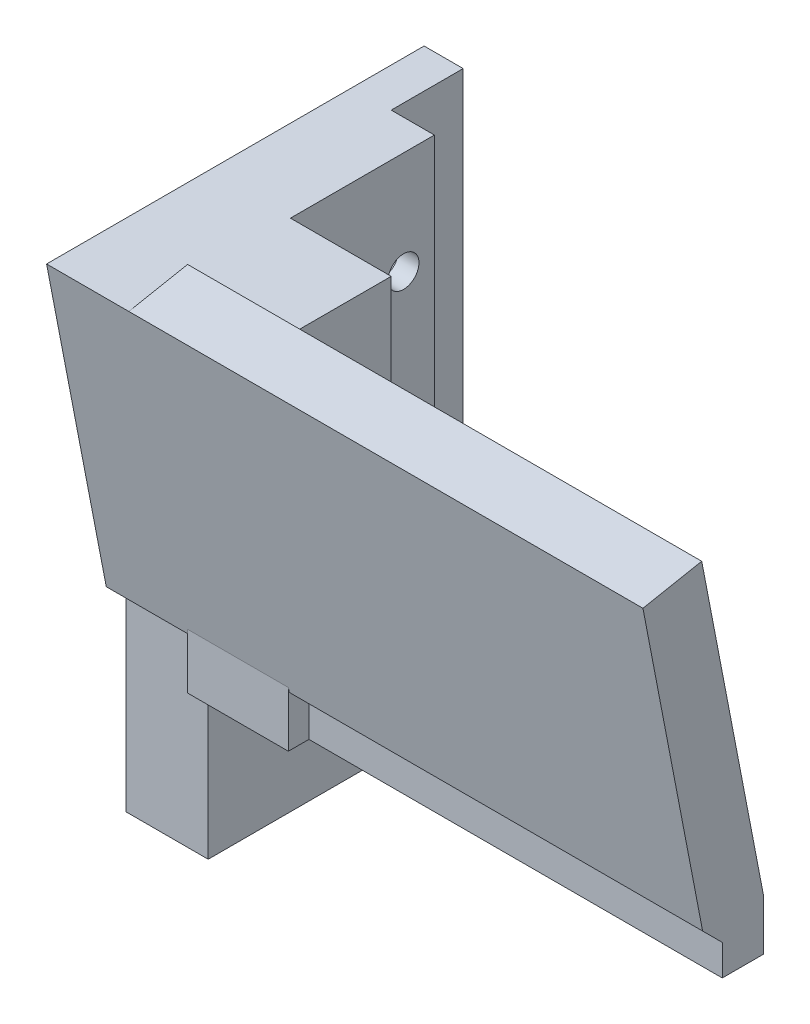
ISO-10303-21;
HEADER;
FILE_DESCRIPTION(('STEP AP214'),'2;1');
FILE_NAME('part.step','',(''),(''),'','','');
FILE_SCHEMA(('AUTOMOTIVE_DESIGN { 1 0 10303 214 1 1 1 1 }'));
ENDSEC;
DATA;
#1=APPLICATION_CONTEXT('core data for automotive mechanical design processes');
#2=APPLICATION_PROTOCOL_DEFINITION('international standard','automotive_design',2000,#1);
#3=PRODUCT_CONTEXT('',#1,'mechanical');
#4=PRODUCT('Part','Part','',(#3));
#5=PRODUCT_RELATED_PRODUCT_CATEGORY('part','',(#4));
#6=PRODUCT_DEFINITION_FORMATION('','',#4);
#7=PRODUCT_DEFINITION_CONTEXT('part definition',#1,'design');
#8=PRODUCT_DEFINITION('design','',#6,#7);
#9=PRODUCT_DEFINITION_SHAPE('','',#8);
#10=(LENGTH_UNIT() NAMED_UNIT(*) SI_UNIT(.MILLI.,.METRE.));
#11=(NAMED_UNIT(*) PLANE_ANGLE_UNIT() SI_UNIT($,.RADIAN.));
#12=(NAMED_UNIT(*) SI_UNIT($,.STERADIAN.) SOLID_ANGLE_UNIT());
#13=UNCERTAINTY_MEASURE_WITH_UNIT(LENGTH_MEASURE(1.E-05),#10,'distance_accuracy_value','');
#14=(GEOMETRIC_REPRESENTATION_CONTEXT(3) GLOBAL_UNCERTAINTY_ASSIGNED_CONTEXT((#13)) GLOBAL_UNIT_ASSIGNED_CONTEXT((#10,
#11,#12)) REPRESENTATION_CONTEXT('',''));
#15=CARTESIAN_POINT('',(0.,0.,0.));
#16=DIRECTION('',(0.,0.,1.));
#17=DIRECTION('',(1.,0.,0.));
#18=AXIS2_PLACEMENT_3D('',#15,#16,#17);
#19=CARTESIAN_POINT('',(0.,-17.211102550928,10.));
#20=DIRECTION('',(0.,0.,-1.));
#21=DIRECTION('',(-1.,0.,0.));
#22=AXIS2_PLACEMENT_3D('',#19,#20,#21);
#23=PLANE('',#22);
#24=DIRECTION('',(0.,-1.,0.));
#25=VECTOR('',#24,1.);
#26=CARTESIAN_POINT('',(0.,-5.,10.));
#27=LINE('',#26,#25);
#28=CARTESIAN_POINT('',(0.,5.,10.));
#29=VERTEX_POINT('',#28);
#30=CARTESIAN_POINT('',(0.,-10.,10.));
#31=VERTEX_POINT('',#30);
#32=EDGE_CURVE('E233',#29,#31,#27,.T.);
#33=ORIENTED_EDGE('',*,*,#32,.F.);
#34=DIRECTION('',(0.,1.,0.));
#35=VECTOR('',#34,1.);
#36=CARTESIAN_POINT('',(0.,-17.211102550928,10.));
#37=LINE('',#36,#35);
#38=CARTESIAN_POINT('',(0.,7.99999999999999,10.));
#39=VERTEX_POINT('',#38);
#40=EDGE_CURVE('E214',#29,#39,#37,.T.);
#41=ORIENTED_EDGE('',*,*,#40,.T.);
#42=DIRECTION('',(-1.,0.,0.));
#43=VECTOR('',#42,1.);
#44=CARTESIAN_POINT('',(-5.,7.99999999999999,10.));
#45=LINE('',#44,#43);
#46=CARTESIAN_POINT('',(-8.,7.99999999999999,10.));
#47=VERTEX_POINT('',#46);
#48=EDGE_CURVE('E349',#39,#47,#45,.T.);
#49=ORIENTED_EDGE('',*,*,#48,.T.);
#50=DIRECTION('',(0.,1.,0.));
#51=VECTOR('',#50,1.);
#52=CARTESIAN_POINT('',(-7.99999999999999,-10.,10.));
#53=LINE('',#52,#51);
#54=CARTESIAN_POINT('',(-7.99999999999999,-10.,10.));
#55=VERTEX_POINT('',#54);
#56=EDGE_CURVE('E271',#55,#47,#53,.T.);
#57=ORIENTED_EDGE('',*,*,#56,.F.);
#58=DIRECTION('',(-1.,0.,0.));
#59=VECTOR('',#58,1.);
#60=CARTESIAN_POINT('',(0.,-10.,10.));
#61=LINE('',#60,#59);
#62=EDGE_CURVE('E309',#31,#55,#61,.T.);
#63=ORIENTED_EDGE('',*,*,#62,.F.);
#64=EDGE_LOOP('',(#33,#41,#49,#57,#63));
#65=FACE_BOUND('',#64,.T.);
#66=ADVANCED_FACE('F42',(#65),#23,.F.);
#67=CARTESIAN_POINT('',(-20.,5.,-56.8276253029822));
#68=DIRECTION('',(0.,1.,0.));
#69=DIRECTION('',(-1.,0.,0.));
#70=AXIS2_PLACEMENT_3D('',#67,#68,#69);
#71=PLANE('',#70);
#72=DIRECTION('',(-1.,0.,0.));
#73=VECTOR('',#72,1.);
#74=CARTESIAN_POINT('',(-20.,5.,10.));
#75=LINE('',#74,#73);
#76=CARTESIAN_POINT('',(50.,5.,10.));
#77=VERTEX_POINT('',#76);
#78=CARTESIAN_POINT('',(9.8,5.,10.));
#79=VERTEX_POINT('',#78);
#80=EDGE_CURVE('E297',#77,#79,#75,.T.);
#81=ORIENTED_EDGE('',*,*,#80,.T.);
#82=DIRECTION('',(0.,0.,1.));
#83=VECTOR('',#82,1.);
#84=CARTESIAN_POINT('',(9.8,5.,2.));
#85=LINE('',#84,#83);
#86=CARTESIAN_POINT('',(9.8,5.,12.));
#87=VERTEX_POINT('',#86);
#88=EDGE_CURVE('E208',#79,#87,#85,.T.);
#89=ORIENTED_EDGE('',*,*,#88,.T.);
#90=DIRECTION('',(-1.,0.,0.));
#91=VECTOR('',#90,1.);
#92=CARTESIAN_POINT('',(0.,5.,12.));
#93=LINE('',#92,#91);
#94=CARTESIAN_POINT('',(0.,5.,12.));
#95=VERTEX_POINT('',#94);
#96=EDGE_CURVE('E212',#87,#95,#93,.T.);
#97=ORIENTED_EDGE('',*,*,#96,.T.);
#98=DIRECTION('',(0.,0.,-1.));
#99=VECTOR('',#98,1.);
#100=CARTESIAN_POINT('',(0.,5.,2.));
#101=LINE('',#100,#99);
#102=EDGE_CURVE('E215',#95,#29,#101,.T.);
#103=ORIENTED_EDGE('',*,*,#102,.T.);
#104=DIRECTION('',(0.,0.,-1.));
#105=VECTOR('',#104,1.);
#106=CARTESIAN_POINT('',(0.,5.,22.8062484748657));
#107=LINE('',#106,#105);
#108=CARTESIAN_POINT('',(0.,5.,2.));
#109=VERTEX_POINT('',#108);
#110=EDGE_CURVE('E232',#29,#109,#107,.T.);
#111=ORIENTED_EDGE('',*,*,#110,.T.);
#112=DIRECTION('',(1.,0.,0.));
#113=VECTOR('',#112,1.);
#114=CARTESIAN_POINT('',(0.,5.,2.));
#115=LINE('',#114,#113);
#116=CARTESIAN_POINT('',(9.8,5.,2.));
#117=VERTEX_POINT('',#116);
#118=EDGE_CURVE('E376',#109,#117,#115,.T.);
#119=ORIENTED_EDGE('',*,*,#118,.T.);
#120=CARTESIAN_POINT('',(9.8,5.,6.));
#121=VERTEX_POINT('',#120);
#122=EDGE_CURVE('E194',#117,#121,#85,.T.);
#123=ORIENTED_EDGE('',*,*,#122,.T.);
#124=DIRECTION('',(-1.,0.,0.));
#125=VECTOR('',#124,1.);
#126=CARTESIAN_POINT('',(0.,5.,6.));
#127=LINE('',#126,#125);
#128=CARTESIAN_POINT('',(50.,5.,6.));
#129=VERTEX_POINT('',#128);
#130=EDGE_CURVE('E346',#129,#121,#127,.T.);
#131=ORIENTED_EDGE('',*,*,#130,.F.);
#132=DIRECTION('',(0.,0.,1.));
#133=VECTOR('',#132,1.);
#134=CARTESIAN_POINT('',(50.,5.,10.));
#135=LINE('',#134,#133);
#136=EDGE_CURVE('E235',#129,#77,#135,.T.);
#137=ORIENTED_EDGE('',*,*,#136,.T.);
#138=EDGE_LOOP('',(#81,#89,#97,#103,#111,#119,#123,#131,#137));
#139=FACE_BOUND('',#138,.T.);
#140=ADVANCED_FACE('F379',(#139),#71,.F.);
#141=CARTESIAN_POINT('',(50.,0.,0.));
#142=DIRECTION('',(-1.,0.,0.));
#143=DIRECTION('',(0.,0.,1.));
#144=AXIS2_PLACEMENT_3D('',#141,#142,#143);
#145=PLANE('',#144);
#146=DIRECTION('',(0.,1.,0.));
#147=VECTOR('',#146,1.);
#148=CARTESIAN_POINT('',(50.,-60.1597448159378,10.));
#149=LINE('',#148,#147);
#150=CARTESIAN_POINT('',(50.,7.99999999999999,10.));
#151=VERTEX_POINT('',#150);
#152=EDGE_CURVE('E300',#77,#151,#149,.T.);
#153=ORIENTED_EDGE('',*,*,#152,.F.);
#154=ORIENTED_EDGE('',*,*,#136,.F.);
#155=DIRECTION('',(0.,1.,0.));
#156=VECTOR('',#155,1.);
#157=CARTESIAN_POINT('',(50.,-60.3587132480567,6.));
#158=LINE('',#157,#156);
#159=CARTESIAN_POINT('',(50.,10.,6.));
#160=VERTEX_POINT('',#159);
#161=EDGE_CURVE('E304',#129,#160,#158,.T.);
#162=ORIENTED_EDGE('',*,*,#161,.T.);
#163=DIRECTION('',(0.,0.981896777402909,0.189416785227133));
#164=VECTOR('',#163,1.);
#165=CARTESIAN_POINT('',(50.,41.10273810926,12.));
#166=LINE('',#165,#164);
#167=CARTESIAN_POINT('',(50.,41.10273810926,12.));
#168=VERTEX_POINT('',#167);
#169=EDGE_CURVE('E315',#160,#168,#166,.T.);
#170=ORIENTED_EDGE('',*,*,#169,.T.);
#171=DIRECTION('',(0.,-0.189416785227132,0.981896777402909));
#172=VECTOR('',#171,1.);
#173=CARTESIAN_POINT('',(50.,40.,17.7163624359023));
#174=LINE('',#173,#172);
#175=CARTESIAN_POINT('',(50.,40.,17.7163624359023));
#176=VERTEX_POINT('',#175);
#177=EDGE_CURVE('E317',#168,#176,#174,.T.);
#178=ORIENTED_EDGE('',*,*,#177,.T.);
#179=DIRECTION('',(0.,-0.981896777402909,-0.189416785227133));
#180=VECTOR('',#179,1.);
#181=CARTESIAN_POINT('',(50.,0.,10.));
#182=LINE('',#181,#180);
#183=CARTESIAN_POINT('',(50.,9.91214200582735,11.9121420058274));
#184=VERTEX_POINT('',#183);
#185=EDGE_CURVE('E320',#176,#184,#182,.T.);
#186=ORIENTED_EDGE('',*,*,#185,.T.);
#187=DIRECTION('',(0.,0.707106781186544,0.707106781186551));
#188=VECTOR('',#187,1.);
#189=CARTESIAN_POINT('',(50.,-0.999999999999964,0.999999999999954));
#190=LINE('',#189,#188);
#191=EDGE_CURVE('E340',#184,#151,#190,.F.);
#192=ORIENTED_EDGE('',*,*,#191,.T.);
#193=EDGE_LOOP('',(#153,#154,#162,#170,#178,#186,#192));
#194=FACE_BOUND('',#193,.T.);
#195=ADVANCED_FACE('F391',(#194),#145,.F.);
#196=CARTESIAN_POINT('',(0.,-60.3587132480567,6.));
#197=DIRECTION('',(0.,0.,1.));
#198=DIRECTION('',(1.,0.,0.));
#199=AXIS2_PLACEMENT_3D('',#196,#197,#198);
#200=PLANE('',#199);
#201=ORIENTED_EDGE('',*,*,#130,.T.);
#202=DIRECTION('',(0.,1.,0.));
#203=VECTOR('',#202,1.);
#204=CARTESIAN_POINT('',(9.8,-60.3587132480567,6.));
#205=LINE('',#204,#203);
#206=CARTESIAN_POINT('',(9.8,10.,6.));
#207=VERTEX_POINT('',#206);
#208=EDGE_CURVE('E229',#121,#207,#205,.T.);
#209=ORIENTED_EDGE('',*,*,#208,.T.);
#210=DIRECTION('',(-1.,0.,0.));
#211=VECTOR('',#210,1.);
#212=CARTESIAN_POINT('',(50.,10.,6.));
#213=LINE('',#212,#211);
#214=EDGE_CURVE('E332',#160,#207,#213,.T.);
#215=ORIENTED_EDGE('',*,*,#214,.F.);
#216=ORIENTED_EDGE('',*,*,#161,.F.);
#217=EDGE_LOOP('',(#201,#209,#215,#216));
#218=FACE_BOUND('',#217,.T.);
#219=ADVANCED_FACE('F461',(#218),#200,.F.);
#220=CARTESIAN_POINT('',(4.24264068711929,0.,-8.99999999999999));
#221=DIRECTION('',(-1.,0.,0.));
#222=DIRECTION('',(0.,-1.,0.));
#223=AXIS2_PLACEMENT_3D('',#220,#221,#222);
#224=CYLINDRICAL_SURFACE('',#223,1.5);
#225=CARTESIAN_POINT('',(0.,0.,-8.99999999999999));
#226=DIRECTION('',(-1.,0.,0.));
#227=DIRECTION('',(0.,0.,1.));
#228=AXIS2_PLACEMENT_3D('',#225,#226,#227);
#229=CIRCLE('',#228,1.5);
#230=CARTESIAN_POINT('',(0.,0.,-7.49999999999999));
#231=VERTEX_POINT('',#230);
#232=EDGE_CURVE('E256',#231,#231,#229,.F.);
#233=ORIENTED_EDGE('',*,*,#232,.T.);
#234=EDGE_LOOP('',(#233));
#235=FACE_BOUND('',#234,.T.);
#236=CARTESIAN_POINT('',(-2.,0.,-8.99999999999999));
#237=DIRECTION('',(-1.,0.,0.));
#238=DIRECTION('',(0.,0.,1.));
#239=AXIS2_PLACEMENT_3D('',#236,#237,#238);
#240=CIRCLE('',#239,1.5);
#241=CARTESIAN_POINT('',(-2.,0.,-7.49999999999999));
#242=VERTEX_POINT('',#241);
#243=EDGE_CURVE('E259',#242,#242,#240,.F.);
#244=ORIENTED_EDGE('',*,*,#243,.F.);
#245=EDGE_LOOP('',(#244));
#246=FACE_BOUND('',#245,.T.);
#247=ADVANCED_FACE('F465',(#235,#246),#224,.F.);
#248=CARTESIAN_POINT('',(4.24264068711929,30.,-9.));
#249=DIRECTION('',(-1.,0.,0.));
#250=DIRECTION('',(0.,-1.,0.));
#251=AXIS2_PLACEMENT_3D('',#248,#249,#250);
#252=CYLINDRICAL_SURFACE('',#251,1.5);
#253=CARTESIAN_POINT('',(0.,30.,-9.));
#254=DIRECTION('',(-1.,0.,0.));
#255=DIRECTION('',(0.,0.,1.));
#256=AXIS2_PLACEMENT_3D('',#253,#254,#255);
#257=CIRCLE('',#256,1.5);
#258=CARTESIAN_POINT('',(0.,30.,-7.5));
#259=VERTEX_POINT('',#258);
#260=EDGE_CURVE('E252',#259,#259,#257,.F.);
#261=ORIENTED_EDGE('',*,*,#260,.T.);
#262=EDGE_LOOP('',(#261));
#263=FACE_BOUND('',#262,.T.);
#264=CARTESIAN_POINT('',(-2.,30.,-9.));
#265=DIRECTION('',(-1.,0.,0.));
#266=DIRECTION('',(0.,0.,1.));
#267=AXIS2_PLACEMENT_3D('',#264,#265,#266);
#268=CIRCLE('',#267,1.5);
#269=CARTESIAN_POINT('',(-2.,30.,-7.5));
#270=VERTEX_POINT('',#269);
#271=EDGE_CURVE('E247',#270,#270,#268,.F.);
#272=ORIENTED_EDGE('',*,*,#271,.F.);
#273=EDGE_LOOP('',(#272));
#274=FACE_BOUND('',#273,.T.);
#275=ADVANCED_FACE('F470',(#263,#274),#252,.F.);
#276=CARTESIAN_POINT('',(0.,40.,0.));
#277=DIRECTION('',(-1.,0.,0.));
#278=DIRECTION('',(0.,0.,1.));
#279=AXIS2_PLACEMENT_3D('',#276,#277,#278);
#280=PLANE('',#279);
#281=ORIENTED_EDGE('',*,*,#260,.F.);
#282=EDGE_LOOP('',(#281));
#283=FACE_BOUND('',#282,.T.);
#284=ORIENTED_EDGE('',*,*,#232,.F.);
#285=EDGE_LOOP('',(#284));
#286=FACE_BOUND('',#285,.T.);
#287=DIRECTION('',(0.,0.,-1.));
#288=VECTOR('',#287,1.);
#289=CARTESIAN_POINT('',(0.,40.,0.));
#290=LINE('',#289,#288);
#291=CARTESIAN_POINT('',(0.,40.,2.));
#292=VERTEX_POINT('',#291);
#293=CARTESIAN_POINT('',(0.,40.,-12.));
#294=VERTEX_POINT('',#293);
#295=EDGE_CURVE('E312',#292,#294,#290,.T.);
#296=ORIENTED_EDGE('',*,*,#295,.F.);
#297=DIRECTION('',(0.,1.,0.));
#298=VECTOR('',#297,1.);
#299=CARTESIAN_POINT('',(0.,-9.00142849854971,2.));
#300=LINE('',#299,#298);
#301=EDGE_CURVE('E197',#109,#292,#300,.T.);
#302=ORIENTED_EDGE('',*,*,#301,.F.);
#303=ORIENTED_EDGE('',*,*,#110,.F.);
#304=ORIENTED_EDGE('',*,*,#32,.T.);
#305=DIRECTION('',(0.,0.,1.));
#306=VECTOR('',#305,1.);
#307=CARTESIAN_POINT('',(0.,-10.,0.));
#308=LINE('',#307,#306);
#309=CARTESIAN_POINT('',(0.,-10.,-12.));
#310=VERTEX_POINT('',#309);
#311=EDGE_CURVE('E306',#310,#31,#308,.T.);
#312=ORIENTED_EDGE('',*,*,#311,.F.);
#313=DIRECTION('',(0.,-1.,0.));
#314=VECTOR('',#313,1.);
#315=CARTESIAN_POINT('',(0.,40.,-12.));
#316=LINE('',#315,#314);
#317=EDGE_CURVE('E276',#294,#310,#316,.T.);
#318=ORIENTED_EDGE('',*,*,#317,.F.);
#319=EDGE_LOOP('',(#296,#302,#303,#304,#312,#318));
#320=FACE_BOUND('',#319,.T.);
#321=ADVANCED_FACE('F411',(#283,#286,#320),#280,.F.);
#322=CARTESIAN_POINT('',(0.,0.,0.));
#323=DIRECTION('',(-1.,0.,0.));
#324=DIRECTION('',(0.,0.,1.));
#325=AXIS2_PLACEMENT_3D('',#322,#323,#324);
#326=PLANE('',#325);
#327=DIRECTION('',(0.,0.981896777402909,0.189416785227133));
#328=VECTOR('',#327,1.);
#329=CARTESIAN_POINT('',(0.,41.10273810926,12.));
#330=LINE('',#329,#328);
#331=CARTESIAN_POINT('',(0.,40.,11.7872718269267));
#332=VERTEX_POINT('',#331);
#333=CARTESIAN_POINT('',(0.,41.10273810926,12.));
#334=VERTEX_POINT('',#333);
#335=EDGE_CURVE('E314',#332,#334,#330,.T.);
#336=ORIENTED_EDGE('',*,*,#335,.F.);
#337=DIRECTION('',(0.,0.,-1.));
#338=VECTOR('',#337,1.);
#339=CARTESIAN_POINT('',(0.,40.,45.516908777501));
#340=LINE('',#339,#338);
#341=CARTESIAN_POINT('',(0.,40.,17.7163624359023));
#342=VERTEX_POINT('',#341);
#343=EDGE_CURVE('E66',#342,#332,#340,.T.);
#344=ORIENTED_EDGE('',*,*,#343,.F.);
#345=DIRECTION('',(0.,-0.189416785227132,0.981896777402909));
#346=VECTOR('',#345,1.);
#347=CARTESIAN_POINT('',(0.,40.,17.7163624359023));
#348=LINE('',#347,#346);
#349=EDGE_CURVE('E318',#334,#342,#348,.T.);
#350=ORIENTED_EDGE('',*,*,#349,.F.);
#351=EDGE_LOOP('',(#336,#344,#350));
#352=FACE_BOUND('',#351,.T.);
#353=ADVANCED_FACE('F423',(#352),#326,.T.);
#354=CARTESIAN_POINT('',(0.,-10.,0.));
#355=DIRECTION('',(0.,-1.,0.));
#356=DIRECTION('',(0.,0.,-1.));
#357=AXIS2_PLACEMENT_3D('',#354,#355,#356);
#358=PLANE('',#357);
#359=ORIENTED_EDGE('',*,*,#311,.T.);
#360=ORIENTED_EDGE('',*,*,#62,.T.);
#361=DIRECTION('',(0.,0.,1.));
#362=VECTOR('',#361,1.);
#363=CARTESIAN_POINT('',(-7.99999999999999,-10.,-19.));
#364=LINE('',#363,#362);
#365=CARTESIAN_POINT('',(-7.99999999999999,-10.,-19.));
#366=VERTEX_POINT('',#365);
#367=EDGE_CURVE('E268',#366,#55,#364,.T.);
#368=ORIENTED_EDGE('',*,*,#367,.F.);
#369=DIRECTION('',(-1.,0.,0.));
#370=VECTOR('',#369,1.);
#371=CARTESIAN_POINT('',(0.,-10.,-19.));
#372=LINE('',#371,#370);
#373=CARTESIAN_POINT('',(-4.2,-10.,-19.));
#374=VERTEX_POINT('',#373);
#375=EDGE_CURVE('E290',#374,#366,#372,.T.);
#376=ORIENTED_EDGE('',*,*,#375,.F.);
#377=DIRECTION('',(0.,0.,-1.));
#378=VECTOR('',#377,1.);
#379=CARTESIAN_POINT('',(-4.2,-10.,-19.));
#380=LINE('',#379,#378);
#381=CARTESIAN_POINT('',(-4.2,-10.,-12.));
#382=VERTEX_POINT('',#381);
#383=EDGE_CURVE('E58',#382,#374,#380,.T.);
#384=ORIENTED_EDGE('',*,*,#383,.F.);
#385=DIRECTION('',(1.,0.,0.));
#386=VECTOR('',#385,1.);
#387=CARTESIAN_POINT('',(-4.2,-10.,-12.));
#388=LINE('',#387,#386);
#389=EDGE_CURVE('E287',#382,#310,#388,.T.);
#390=ORIENTED_EDGE('',*,*,#389,.T.);
#391=EDGE_LOOP('',(#359,#360,#368,#376,#384,#390));
#392=FACE_BOUND('',#391,.T.);
#393=ADVANCED_FACE('F421',(#392),#358,.T.);
#394=CARTESIAN_POINT('',(0.,40.,0.));
#395=DIRECTION('',(0.,1.,0.));
#396=DIRECTION('',(0.,0.,1.));
#397=AXIS2_PLACEMENT_3D('',#394,#395,#396);
#398=PLANE('',#397);
#399=DIRECTION('',(1.,0.,0.));
#400=VECTOR('',#399,1.);
#401=CARTESIAN_POINT('',(-4.2,40.,-12.));
#402=LINE('',#401,#400);
#403=CARTESIAN_POINT('',(-4.2,40.,-12.));
#404=VERTEX_POINT('',#403);
#405=EDGE_CURVE('E285',#404,#294,#402,.T.);
#406=ORIENTED_EDGE('',*,*,#405,.F.);
#407=DIRECTION('',(0.,0.,1.));
#408=VECTOR('',#407,1.);
#409=CARTESIAN_POINT('',(-4.2,40.,-19.));
#410=LINE('',#409,#408);
#411=CARTESIAN_POINT('',(-4.2,40.,-19.));
#412=VERTEX_POINT('',#411);
#413=EDGE_CURVE('E279',#412,#404,#410,.T.);
#414=ORIENTED_EDGE('',*,*,#413,.F.);
#415=DIRECTION('',(1.,0.,0.));
#416=VECTOR('',#415,1.);
#417=CARTESIAN_POINT('',(-5.,40.,-19.));
#418=LINE('',#417,#416);
#419=CARTESIAN_POINT('',(-8.,40.,-19.));
#420=VERTEX_POINT('',#419);
#421=EDGE_CURVE('E294',#420,#412,#418,.T.);
#422=ORIENTED_EDGE('',*,*,#421,.F.);
#423=DIRECTION('',(0.,0.,-1.));
#424=VECTOR('',#423,1.);
#425=CARTESIAN_POINT('',(-8.,40.,17.7163624359023));
#426=LINE('',#425,#424);
#427=CARTESIAN_POINT('',(-8.,40.,17.7163624359023));
#428=VERTEX_POINT('',#427);
#429=EDGE_CURVE('E262',#428,#420,#426,.T.);
#430=ORIENTED_EDGE('',*,*,#429,.F.);
#431=DIRECTION('',(1.,0.,0.));
#432=VECTOR('',#431,1.);
#433=CARTESIAN_POINT('',(0.,40.,17.7163624359023));
#434=LINE('',#433,#432);
#435=EDGE_CURVE('E302',#428,#342,#434,.T.);
#436=ORIENTED_EDGE('',*,*,#435,.T.);
#437=ORIENTED_EDGE('',*,*,#343,.T.);
#438=DIRECTION('',(-1.,0.,0.));
#439=VECTOR('',#438,1.);
#440=CARTESIAN_POINT('',(50.,40.,11.7872718269267));
#441=LINE('',#440,#439);
#442=CARTESIAN_POINT('',(9.8,40.,11.7872718269267));
#443=VERTEX_POINT('',#442);
#444=EDGE_CURVE('E12',#443,#332,#441,.T.);
#445=ORIENTED_EDGE('',*,*,#444,.F.);
#446=DIRECTION('',(0.,0.,-1.));
#447=VECTOR('',#446,1.);
#448=CARTESIAN_POINT('',(9.8,40.,2.));
#449=LINE('',#448,#447);
#450=CARTESIAN_POINT('',(9.8,40.,2.));
#451=VERTEX_POINT('',#450);
#452=EDGE_CURVE('E179',#443,#451,#449,.T.);
#453=ORIENTED_EDGE('',*,*,#452,.T.);
#454=DIRECTION('',(-1.,0.,0.));
#455=VECTOR('',#454,1.);
#456=CARTESIAN_POINT('',(0.,40.,2.));
#457=LINE('',#456,#455);
#458=EDGE_CURVE('E184',#451,#292,#457,.T.);
#459=ORIENTED_EDGE('',*,*,#458,.T.);
#460=ORIENTED_EDGE('',*,*,#295,.T.);
#461=EDGE_LOOP('',(#406,#414,#422,#430,#436,#437,#445,#453,#459,#460));
#462=FACE_BOUND('',#461,.T.);
#463=ADVANCED_FACE('F182',(#462),#398,.T.);
#464=CARTESIAN_POINT('',(50.,41.10273810926,12.));
#465=DIRECTION('',(0.,-0.189416785227133,0.981896777402909));
#466=DIRECTION('',(0.,-0.981896777402909,-0.189416785227133));
#467=AXIS2_PLACEMENT_3D('',#464,#465,#466);
#468=PLANE('',#467);
#469=ORIENTED_EDGE('',*,*,#214,.T.);
#470=DIRECTION('',(0.,0.981896777402909,0.189416785227133));
#471=VECTOR('',#470,1.);
#472=CARTESIAN_POINT('',(9.8,41.10273810926,12.));
#473=LINE('',#472,#471);
#474=EDGE_CURVE('E227',#207,#443,#473,.T.);
#475=ORIENTED_EDGE('',*,*,#474,.T.);
#476=ORIENTED_EDGE('',*,*,#444,.T.);
#477=ORIENTED_EDGE('',*,*,#335,.T.);
#478=DIRECTION('',(-1.,0.,0.));
#479=VECTOR('',#478,1.);
#480=CARTESIAN_POINT('',(50.,41.10273810926,12.));
#481=LINE('',#480,#479);
#482=EDGE_CURVE('E329',#168,#334,#481,.T.);
#483=ORIENTED_EDGE('',*,*,#482,.F.);
#484=ORIENTED_EDGE('',*,*,#169,.F.);
#485=EDGE_LOOP('',(#469,#475,#476,#477,#483,#484));
#486=FACE_BOUND('',#485,.T.);
#487=ADVANCED_FACE('F429',(#486),#468,.F.);
#488=CARTESIAN_POINT('',(50.,40.,17.7163624359023));
#489=DIRECTION('',(0.,-0.981896777402909,-0.189416785227132));
#490=DIRECTION('',(0.,0.189416785227132,-0.981896777402909));
#491=AXIS2_PLACEMENT_3D('',#488,#489,#490);
#492=PLANE('',#491);
#493=ORIENTED_EDGE('',*,*,#349,.T.);
#494=DIRECTION('',(-1.,0.,0.));
#495=VECTOR('',#494,1.);
#496=CARTESIAN_POINT('',(50.,40.,17.7163624359023));
#497=LINE('',#496,#495);
#498=EDGE_CURVE('E323',#176,#342,#497,.T.);
#499=ORIENTED_EDGE('',*,*,#498,.F.);
#500=ORIENTED_EDGE('',*,*,#177,.F.);
#501=ORIENTED_EDGE('',*,*,#482,.T.);
#502=EDGE_LOOP('',(#493,#499,#500,#501));
#503=FACE_BOUND('',#502,.T.);
#504=ADVANCED_FACE('F450',(#503),#492,.F.);
#505=CARTESIAN_POINT('',(50.,0.,10.));
#506=DIRECTION('',(0.,0.189416785227133,-0.981896777402909));
#507=DIRECTION('',(0.,0.981896777402909,0.189416785227133));
#508=AXIS2_PLACEMENT_3D('',#505,#506,#507);
#509=PLANE('',#508);
#510=DIRECTION('',(-1.,0.,0.));
#511=VECTOR('',#510,1.);
#512=CARTESIAN_POINT('',(50.,9.91214200582735,11.9121420058274));
#513=LINE('',#512,#511);
#514=CARTESIAN_POINT('',(-8.,9.91214200582734,11.9121420058274));
#515=VERTEX_POINT('',#514);
#516=CARTESIAN_POINT('',(0.,9.91214200582735,11.9121420058274));
#517=VERTEX_POINT('',#516);
#518=EDGE_CURVE('E352',#515,#517,#513,.F.);
#519=ORIENTED_EDGE('',*,*,#518,.T.);
#520=DIRECTION('',(0.,0.981896777402909,0.189416785227133));
#521=VECTOR('',#520,1.);
#522=CARTESIAN_POINT('',(0.,0.,10.));
#523=LINE('',#522,#521);
#524=CARTESIAN_POINT('',(0.,10.3675793697533,12.));
#525=VERTEX_POINT('',#524);
#526=EDGE_CURVE('E218',#517,#525,#523,.T.);
#527=ORIENTED_EDGE('',*,*,#526,.T.);
#528=DIRECTION('',(1.,0.,0.));
#529=VECTOR('',#528,1.);
#530=CARTESIAN_POINT('',(50.,10.3675793697533,12.));
#531=LINE('',#530,#529);
#532=CARTESIAN_POINT('',(9.8,10.3675793697533,12.));
#533=VERTEX_POINT('',#532);
#534=EDGE_CURVE('E51',#525,#533,#531,.T.);
#535=ORIENTED_EDGE('',*,*,#534,.T.);
#536=DIRECTION('',(0.,-0.981896777402909,-0.189416785227133));
#537=VECTOR('',#536,1.);
#538=CARTESIAN_POINT('',(9.8,0.,10.));
#539=LINE('',#538,#537);
#540=CARTESIAN_POINT('',(9.80000000000001,9.91214200582735,11.9121420058274));
#541=VERTEX_POINT('',#540);
#542=EDGE_CURVE('E224',#533,#541,#539,.T.);
#543=ORIENTED_EDGE('',*,*,#542,.T.);
#544=DIRECTION('',(-1.,0.,0.));
#545=VECTOR('',#544,1.);
#546=CARTESIAN_POINT('',(50.,9.91214200582735,11.9121420058274));
#547=LINE('',#546,#545);
#548=EDGE_CURVE('E338',#541,#184,#547,.F.);
#549=ORIENTED_EDGE('',*,*,#548,.T.);
#550=ORIENTED_EDGE('',*,*,#185,.F.);
#551=ORIENTED_EDGE('',*,*,#498,.T.);
#552=ORIENTED_EDGE('',*,*,#435,.F.);
#553=DIRECTION('',(0.,0.981896777402909,0.189416785227133));
#554=VECTOR('',#553,1.);
#555=CARTESIAN_POINT('',(-8.,9.91214200582734,11.9121420058274));
#556=LINE('',#555,#554);
#557=EDGE_CURVE('E255',#515,#428,#556,.T.);
#558=ORIENTED_EDGE('',*,*,#557,.F.);
#559=EDGE_LOOP('',(#519,#527,#535,#543,#549,#550,#551,#552,#558));
#560=FACE_BOUND('',#559,.T.);
#561=ADVANCED_FACE('F363',(#560),#509,.F.);
#562=CARTESIAN_POINT('',(-10.1843699155931,10.,12.));
#563=DIRECTION('',(0.,-0.707106781186551,0.707106781186544));
#564=DIRECTION('',(-1.,0.,0.));
#565=AXIS2_PLACEMENT_3D('',#562,#563,#564);
#566=PLANE('',#565);
#567=ORIENTED_EDGE('',*,*,#548,.F.);
#568=DIRECTION('',(0.,0.707106781186544,0.707106781186551));
#569=VECTOR('',#568,1.);
#570=CARTESIAN_POINT('',(9.80000000000001,10.,12.));
#571=LINE('',#570,#569);
#572=CARTESIAN_POINT('',(9.8,7.99999999999999,10.));
#573=VERTEX_POINT('',#572);
#574=EDGE_CURVE('E221',#541,#573,#571,.F.);
#575=ORIENTED_EDGE('',*,*,#574,.T.);
#576=DIRECTION('',(-1.,0.,0.));
#577=VECTOR('',#576,1.);
#578=CARTESIAN_POINT('',(0.,7.99999999999999,10.));
#579=LINE('',#578,#577);
#580=EDGE_CURVE('E335',#151,#573,#579,.T.);
#581=ORIENTED_EDGE('',*,*,#580,.F.);
#582=ORIENTED_EDGE('',*,*,#191,.F.);
#583=EDGE_LOOP('',(#567,#575,#581,#582));
#584=FACE_BOUND('',#583,.T.);
#585=ADVANCED_FACE('F384',(#584),#566,.T.);
#586=ORIENTED_EDGE('',*,*,#580,.T.);
#587=DIRECTION('',(0.,-1.,0.));
#588=VECTOR('',#587,1.);
#589=CARTESIAN_POINT('',(9.8,-17.211102550928,10.));
#590=LINE('',#589,#588);
#591=EDGE_CURVE('E355',#573,#79,#590,.T.);
#592=ORIENTED_EDGE('',*,*,#591,.T.);
#593=ORIENTED_EDGE('',*,*,#80,.F.);
#594=ORIENTED_EDGE('',*,*,#152,.T.);
#595=EDGE_LOOP('',(#586,#592,#593,#594));
#596=FACE_BOUND('',#595,.T.);
#597=ADVANCED_FACE('F387',(#596),#23,.F.);
#598=CARTESIAN_POINT('',(0.,10.,12.));
#599=DIRECTION('',(0.,-0.707106781186552,0.707106781186543));
#600=DIRECTION('',(-1.,0.,0.));
#601=AXIS2_PLACEMENT_3D('',#598,#599,#600);
#602=PLANE('',#601);
#603=ORIENTED_EDGE('',*,*,#518,.F.);
#604=DIRECTION('',(0.,0.707106781186543,0.707106781186552));
#605=VECTOR('',#604,1.);
#606=CARTESIAN_POINT('',(-8.,7.99999999999999,10.));
#607=LINE('',#606,#605);
#608=EDGE_CURVE('E273',#47,#515,#607,.T.);
#609=ORIENTED_EDGE('',*,*,#608,.F.);
#610=ORIENTED_EDGE('',*,*,#48,.F.);
#611=DIRECTION('',(0.,-0.707106781186544,-0.707106781186551));
#612=VECTOR('',#611,1.);
#613=CARTESIAN_POINT('',(0.,10.,12.));
#614=LINE('',#613,#612);
#615=EDGE_CURVE('E343',#39,#517,#614,.F.);
#616=ORIENTED_EDGE('',*,*,#615,.T.);
#617=EDGE_LOOP('',(#603,#609,#610,#616));
#618=FACE_BOUND('',#617,.T.);
#619=ADVANCED_FACE('F45',(#618),#602,.T.);
#620=CARTESIAN_POINT('',(0.,0.,-19.));
#621=DIRECTION('',(0.,0.,-1.));
#622=DIRECTION('',(-1.,0.,0.));
#623=AXIS2_PLACEMENT_3D('',#620,#621,#622);
#624=PLANE('',#623);
#625=DIRECTION('',(0.,1.,0.));
#626=VECTOR('',#625,1.);
#627=CARTESIAN_POINT('',(-4.2,40.,-19.));
#628=LINE('',#627,#626);
#629=EDGE_CURVE('E277',#374,#412,#628,.T.);
#630=ORIENTED_EDGE('',*,*,#629,.F.);
#631=ORIENTED_EDGE('',*,*,#375,.T.);
#632=DIRECTION('',(0.,-1.,0.));
#633=VECTOR('',#632,1.);
#634=CARTESIAN_POINT('',(-8.,40.,-19.));
#635=LINE('',#634,#633);
#636=EDGE_CURVE('E265',#420,#366,#635,.T.);
#637=ORIENTED_EDGE('',*,*,#636,.F.);
#638=ORIENTED_EDGE('',*,*,#421,.T.);
#639=EDGE_LOOP('',(#630,#631,#637,#638));
#640=FACE_BOUND('',#639,.T.);
#641=ADVANCED_FACE('F417',(#640),#624,.T.);
#642=CARTESIAN_POINT('',(-4.2,40.,-12.));
#643=DIRECTION('',(0.,0.,1.));
#644=DIRECTION('',(0.,-1.,0.));
#645=AXIS2_PLACEMENT_3D('',#642,#643,#644);
#646=PLANE('',#645);
#647=ORIENTED_EDGE('',*,*,#317,.T.);
#648=ORIENTED_EDGE('',*,*,#389,.F.);
#649=DIRECTION('',(0.,-1.,0.));
#650=VECTOR('',#649,1.);
#651=CARTESIAN_POINT('',(-4.2,40.,-12.));
#652=LINE('',#651,#650);
#653=EDGE_CURVE('E282',#404,#382,#652,.T.);
#654=ORIENTED_EDGE('',*,*,#653,.F.);
#655=ORIENTED_EDGE('',*,*,#405,.T.);
#656=EDGE_LOOP('',(#647,#648,#654,#655));
#657=FACE_BOUND('',#656,.T.);
#658=ADVANCED_FACE('F414',(#657),#646,.F.);
#659=CARTESIAN_POINT('',(-4.2,0.,0.));
#660=DIRECTION('',(-1.,0.,0.));
#661=DIRECTION('',(0.,0.,1.));
#662=AXIS2_PLACEMENT_3D('',#659,#660,#661);
#663=PLANE('',#662);
#664=ORIENTED_EDGE('',*,*,#629,.T.);
#665=ORIENTED_EDGE('',*,*,#413,.T.);
#666=ORIENTED_EDGE('',*,*,#653,.T.);
#667=ORIENTED_EDGE('',*,*,#383,.T.);
#668=EDGE_LOOP('',(#664,#665,#666,#667));
#669=FACE_BOUND('',#668,.T.);
#670=ADVANCED_FACE('F415',(#669),#663,.F.);
#671=CARTESIAN_POINT('',(-8.,0.,0.));
#672=DIRECTION('',(-1.,0.,0.));
#673=DIRECTION('',(0.,-1.,0.));
#674=AXIS2_PLACEMENT_3D('',#671,#672,#673);
#675=PLANE('',#674);
#676=CARTESIAN_POINT('',(-8.,30.,-9.));
#677=DIRECTION('',(-1.,0.,0.));
#678=DIRECTION('',(0.,-1.,0.));
#679=AXIS2_PLACEMENT_3D('',#676,#677,#678);
#680=CIRCLE('',#679,2.9);
#681=CARTESIAN_POINT('',(-8.,27.1,-9.));
#682=VERTEX_POINT('',#681);
#683=EDGE_CURVE('E240',#682,#682,#680,.T.);
#684=ORIENTED_EDGE('',*,*,#683,.F.);
#685=EDGE_LOOP('',(#684));
#686=FACE_BOUND('',#685,.T.);
#687=CARTESIAN_POINT('',(-8.,0.,-8.99999999999999));
#688=DIRECTION('',(-1.,0.,0.));
#689=DIRECTION('',(0.,-1.,0.));
#690=AXIS2_PLACEMENT_3D('',#687,#688,#689);
#691=CIRCLE('',#690,2.9);
#692=CARTESIAN_POINT('',(-8.,-2.9,-8.99999999999999));
#693=VERTEX_POINT('',#692);
#694=EDGE_CURVE('E239',#693,#693,#691,.T.);
#695=ORIENTED_EDGE('',*,*,#694,.F.);
#696=EDGE_LOOP('',(#695));
#697=FACE_BOUND('',#696,.T.);
#698=ORIENTED_EDGE('',*,*,#557,.T.);
#699=ORIENTED_EDGE('',*,*,#429,.T.);
#700=ORIENTED_EDGE('',*,*,#636,.T.);
#701=ORIENTED_EDGE('',*,*,#367,.T.);
#702=ORIENTED_EDGE('',*,*,#56,.T.);
#703=ORIENTED_EDGE('',*,*,#608,.T.);
#704=EDGE_LOOP('',(#698,#699,#700,#701,#702,#703));
#705=FACE_BOUND('',#704,.T.);
#706=ADVANCED_FACE('F401',(#686,#697,#705),#675,.T.);
#707=CARTESIAN_POINT('',(-2.,40.,0.));
#708=DIRECTION('',(-1.,0.,0.));
#709=DIRECTION('',(0.,0.,1.));
#710=AXIS2_PLACEMENT_3D('',#707,#708,#709);
#711=PLANE('',#710);
#712=CARTESIAN_POINT('',(-2.,30.,-9.));
#713=DIRECTION('',(-1.,0.,0.));
#714=DIRECTION('',(0.,0.,1.));
#715=AXIS2_PLACEMENT_3D('',#712,#713,#714);
#716=CIRCLE('',#715,2.9);
#717=CARTESIAN_POINT('',(-2.,30.,-6.1));
#718=VERTEX_POINT('',#717);
#719=EDGE_CURVE('E243',#718,#718,#716,.F.);
#720=ORIENTED_EDGE('',*,*,#719,.F.);
#721=EDGE_LOOP('',(#720));
#722=FACE_BOUND('',#721,.T.);
#723=ORIENTED_EDGE('',*,*,#271,.T.);
#724=EDGE_LOOP('',(#723));
#725=FACE_BOUND('',#724,.T.);
#726=ADVANCED_FACE('F481',(#722,#725),#711,.T.);
#727=CARTESIAN_POINT('',(8.20243866176395,30.,-9.));
#728=DIRECTION('',(-1.,0.,0.));
#729=DIRECTION('',(0.,-1.,0.));
#730=AXIS2_PLACEMENT_3D('',#727,#728,#729);
#731=CYLINDRICAL_SURFACE('',#730,2.9);
#732=ORIENTED_EDGE('',*,*,#719,.T.);
#733=EDGE_LOOP('',(#732));
#734=FACE_BOUND('',#733,.T.);
#735=ORIENTED_EDGE('',*,*,#683,.T.);
#736=EDGE_LOOP('',(#735));
#737=FACE_BOUND('',#736,.T.);
#738=ADVANCED_FACE('F494',(#734,#737),#731,.F.);
#739=CARTESIAN_POINT('',(-2.,40.,0.));
#740=DIRECTION('',(-1.,0.,0.));
#741=DIRECTION('',(0.,0.,1.));
#742=AXIS2_PLACEMENT_3D('',#739,#740,#741);
#743=PLANE('',#742);
#744=CARTESIAN_POINT('',(-2.,0.,-8.99999999999999));
#745=DIRECTION('',(-1.,0.,0.));
#746=DIRECTION('',(0.,0.,1.));
#747=AXIS2_PLACEMENT_3D('',#744,#745,#746);
#748=CIRCLE('',#747,2.9);
#749=CARTESIAN_POINT('',(-2.,0.,-6.09999999999999));
#750=VERTEX_POINT('',#749);
#751=EDGE_CURVE('E244',#750,#750,#748,.F.);
#752=ORIENTED_EDGE('',*,*,#751,.F.);
#753=EDGE_LOOP('',(#752));
#754=FACE_BOUND('',#753,.T.);
#755=ORIENTED_EDGE('',*,*,#243,.T.);
#756=EDGE_LOOP('',(#755));
#757=FACE_BOUND('',#756,.T.);
#758=ADVANCED_FACE('F490',(#754,#757),#743,.T.);
#759=CARTESIAN_POINT('',(8.20243866176395,0.,-8.99999999999999));
#760=DIRECTION('',(-1.,0.,0.));
#761=DIRECTION('',(0.,-1.,0.));
#762=AXIS2_PLACEMENT_3D('',#759,#760,#761);
#763=CYLINDRICAL_SURFACE('',#762,2.9);
#764=ORIENTED_EDGE('',*,*,#751,.T.);
#765=EDGE_LOOP('',(#764));
#766=FACE_BOUND('',#765,.T.);
#767=ORIENTED_EDGE('',*,*,#694,.T.);
#768=EDGE_LOOP('',(#767));
#769=FACE_BOUND('',#768,.T.);
#770=ADVANCED_FACE('F487',(#766,#769),#763,.F.);
#771=CARTESIAN_POINT('',(0.,-9.00142849854971,2.));
#772=DIRECTION('',(-1.,0.,0.));
#773=DIRECTION('',(0.,0.,1.));
#774=AXIS2_PLACEMENT_3D('',#771,#772,#773);
#775=PLANE('',#774);
#776=ORIENTED_EDGE('',*,*,#526,.F.);
#777=ORIENTED_EDGE('',*,*,#615,.F.);
#778=ORIENTED_EDGE('',*,*,#40,.F.);
#779=ORIENTED_EDGE('',*,*,#102,.F.);
#780=DIRECTION('',(0.,1.,0.));
#781=VECTOR('',#780,1.);
#782=CARTESIAN_POINT('',(0.,-9.00142849854971,12.));
#783=LINE('',#782,#781);
#784=EDGE_CURVE('E202',#95,#525,#783,.T.);
#785=ORIENTED_EDGE('',*,*,#784,.T.);
#786=EDGE_LOOP('',(#776,#777,#778,#779,#785));
#787=FACE_BOUND('',#786,.T.);
#788=ADVANCED_FACE('F372',(#787),#775,.T.);
#789=CARTESIAN_POINT('',(9.8,-9.00142849854971,2.));
#790=DIRECTION('',(1.,0.,0.));
#791=DIRECTION('',(0.,0.,-1.));
#792=AXIS2_PLACEMENT_3D('',#789,#790,#791);
#793=PLANE('',#792);
#794=ORIENTED_EDGE('',*,*,#542,.F.);
#795=DIRECTION('',(0.,1.,0.));
#796=VECTOR('',#795,1.);
#797=CARTESIAN_POINT('',(9.8,-9.00142849854971,12.));
#798=LINE('',#797,#796);
#799=EDGE_CURVE('E198',#87,#533,#798,.T.);
#800=ORIENTED_EDGE('',*,*,#799,.F.);
#801=ORIENTED_EDGE('',*,*,#88,.F.);
#802=ORIENTED_EDGE('',*,*,#591,.F.);
#803=ORIENTED_EDGE('',*,*,#574,.F.);
#804=EDGE_LOOP('',(#794,#800,#801,#802,#803));
#805=FACE_BOUND('',#804,.T.);
#806=ADVANCED_FACE('F381',(#805),#793,.T.);
#807=CARTESIAN_POINT('',(0.,-9.00142849854971,12.));
#808=DIRECTION('',(0.,0.,1.));
#809=DIRECTION('',(1.,0.,0.));
#810=AXIS2_PLACEMENT_3D('',#807,#808,#809);
#811=PLANE('',#810);
#812=ORIENTED_EDGE('',*,*,#534,.F.);
#813=ORIENTED_EDGE('',*,*,#784,.F.);
#814=ORIENTED_EDGE('',*,*,#96,.F.);
#815=ORIENTED_EDGE('',*,*,#799,.T.);
#816=EDGE_LOOP('',(#812,#813,#814,#815));
#817=FACE_BOUND('',#816,.T.);
#818=ADVANCED_FACE('F367',(#817),#811,.T.);
#819=ORIENTED_EDGE('',*,*,#208,.F.);
#820=ORIENTED_EDGE('',*,*,#122,.F.);
#821=DIRECTION('',(0.,1.,0.));
#822=VECTOR('',#821,1.);
#823=CARTESIAN_POINT('',(9.8,-9.00142849854971,2.));
#824=LINE('',#823,#822);
#825=EDGE_CURVE('E191',#117,#451,#824,.T.);
#826=ORIENTED_EDGE('',*,*,#825,.T.);
#827=ORIENTED_EDGE('',*,*,#452,.F.);
#828=ORIENTED_EDGE('',*,*,#474,.F.);
#829=EDGE_LOOP('',(#819,#820,#826,#827,#828));
#830=FACE_BOUND('',#829,.T.);
#831=ADVANCED_FACE('F192',(#830),#793,.T.);
#832=CARTESIAN_POINT('',(0.,-9.00142849854971,2.));
#833=DIRECTION('',(0.,0.,-1.));
#834=DIRECTION('',(-1.,0.,0.));
#835=AXIS2_PLACEMENT_3D('',#832,#833,#834);
#836=PLANE('',#835);
#837=ORIENTED_EDGE('',*,*,#118,.F.);
#838=ORIENTED_EDGE('',*,*,#301,.T.);
#839=ORIENTED_EDGE('',*,*,#458,.F.);
#840=ORIENTED_EDGE('',*,*,#825,.F.);
#841=EDGE_LOOP('',(#837,#838,#839,#840));
#842=FACE_BOUND('',#841,.T.);
#843=ADVANCED_FACE('F200',(#842),#836,.T.);
#844=CLOSED_SHELL('',(#66,#140,#195,#219,#247,#275,#321,#353,#393,#463,#487,#504,#561,#585,#597,
#619,#641,#658,#670,#706,#726,#738,#758,#770,#788,#806,#818,#831,#843));
#845=MANIFOLD_SOLID_BREP('B2',#844);
#846=ADVANCED_BREP_SHAPE_REPRESENTATION('',(#18,#845),#14);
#847=SHAPE_DEFINITION_REPRESENTATION(#9,#846);
ENDSEC;
END-ISO-10303-21;
